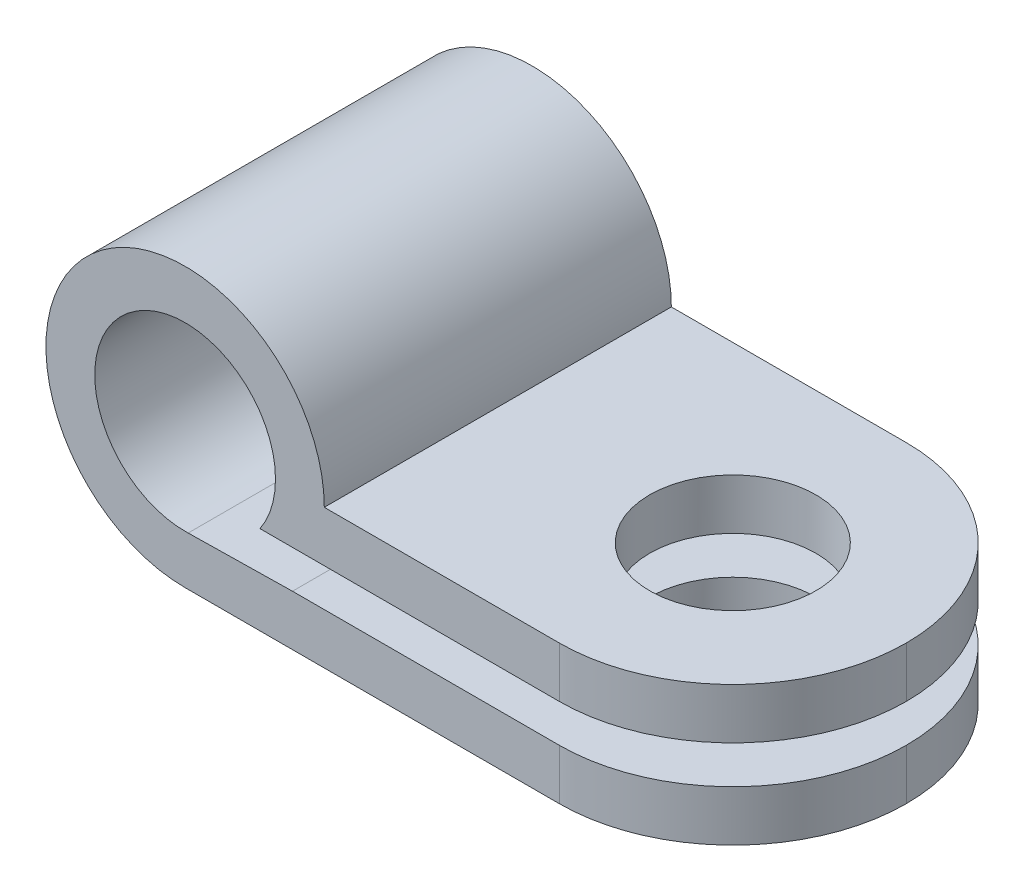
ISO-10303-21;
HEADER;
FILE_DESCRIPTION(('STEP AP214'),'2;1');
FILE_NAME('part.step','',(''),(''),'','','');
FILE_SCHEMA(('AUTOMOTIVE_DESIGN { 1 0 10303 214 1 1 1 1 }'));
ENDSEC;
DATA;
#1=APPLICATION_CONTEXT('core data for automotive mechanical design processes');
#2=APPLICATION_PROTOCOL_DEFINITION('international standard','automotive_design',2000,#1);
#3=PRODUCT_CONTEXT('',#1,'mechanical');
#4=PRODUCT('Part','Part','',(#3));
#5=PRODUCT_RELATED_PRODUCT_CATEGORY('part','',(#4));
#6=PRODUCT_DEFINITION_FORMATION('','',#4);
#7=PRODUCT_DEFINITION_CONTEXT('part definition',#1,'design');
#8=PRODUCT_DEFINITION('design','',#6,#7);
#9=PRODUCT_DEFINITION_SHAPE('','',#8);
#10=(LENGTH_UNIT() NAMED_UNIT(*) SI_UNIT(.MILLI.,.METRE.));
#11=(NAMED_UNIT(*) PLANE_ANGLE_UNIT() SI_UNIT($,.RADIAN.));
#12=(NAMED_UNIT(*) SI_UNIT($,.STERADIAN.) SOLID_ANGLE_UNIT());
#13=UNCERTAINTY_MEASURE_WITH_UNIT(LENGTH_MEASURE(1.E-05),#10,'distance_accuracy_value','');
#14=(GEOMETRIC_REPRESENTATION_CONTEXT(3) GLOBAL_UNCERTAINTY_ASSIGNED_CONTEXT((#13)) GLOBAL_UNIT_ASSIGNED_CONTEXT((#10,
#11,#12)) REPRESENTATION_CONTEXT('',''));
#15=CARTESIAN_POINT('',(0.,0.,0.));
#16=DIRECTION('',(0.,0.,1.));
#17=DIRECTION('',(1.,0.,0.));
#18=AXIS2_PLACEMENT_3D('',#15,#16,#17);
#19=CARTESIAN_POINT('',(0.,0.,9.6));
#20=DIRECTION('',(0.,-1.,0.));
#21=DIRECTION('',(1.,0.,0.));
#22=AXIS2_PLACEMENT_3D('',#19,#20,#21);
#23=PLANE('',#22);
#24=CARTESIAN_POINT('',(10.35,0.,4.8));
#25=DIRECTION('',(0.,1.,0.));
#26=DIRECTION('',(-1.,0.,0.));
#27=AXIS2_PLACEMENT_3D('',#24,#25,#26);
#28=CIRCLE('',#27,2.3);
#29=CARTESIAN_POINT('',(8.05,0.,4.8));
#30=VERTEX_POINT('',#29);
#31=EDGE_CURVE('E378',#30,#30,#28,.T.);
#32=ORIENTED_EDGE('',*,*,#31,.F.);
#33=EDGE_LOOP('',(#32));
#34=FACE_BOUND('',#33,.T.);
#35=CARTESIAN_POINT('',(10.35,0.,4.8));
#36=DIRECTION('',(0.,-1.,0.));
#37=DIRECTION('',(1.,0.,0.));
#38=AXIS2_PLACEMENT_3D('',#35,#36,#37);
#39=CIRCLE('',#38,4.8);
#40=CARTESIAN_POINT('',(10.35,0.,9.6));
#41=VERTEX_POINT('',#40);
#42=CARTESIAN_POINT('',(15.15,0.,4.8));
#43=VERTEX_POINT('',#42);
#44=EDGE_CURVE('E158',#41,#43,#39,.F.);
#45=ORIENTED_EDGE('',*,*,#44,.T.);
#46=CARTESIAN_POINT('',(10.35,0.,4.8));
#47=DIRECTION('',(0.,-1.,0.));
#48=DIRECTION('',(1.,0.,0.));
#49=AXIS2_PLACEMENT_3D('',#46,#47,#48);
#50=CIRCLE('',#49,4.8);
#51=CARTESIAN_POINT('',(10.35,0.,0.));
#52=VERTEX_POINT('',#51);
#53=EDGE_CURVE('E160',#43,#52,#50,.F.);
#54=ORIENTED_EDGE('',*,*,#53,.T.);
#55=DIRECTION('',(-1.,0.,0.));
#56=VECTOR('',#55,1.);
#57=CARTESIAN_POINT('',(0.,0.,0.));
#58=LINE('',#57,#56);
#59=CARTESIAN_POINT('',(3.85000000000002,0.,0.));
#60=VERTEX_POINT('',#59);
#61=EDGE_CURVE('E141',#52,#60,#58,.T.);
#62=ORIENTED_EDGE('',*,*,#61,.T.);
#63=DIRECTION('',(0.,0.,-1.));
#64=VECTOR('',#63,1.);
#65=CARTESIAN_POINT('',(3.85000000000002,0.,9.6));
#66=LINE('',#65,#64);
#67=CARTESIAN_POINT('',(3.85000000000002,0.,9.6));
#68=VERTEX_POINT('',#67);
#69=EDGE_CURVE('E134',#68,#60,#66,.T.);
#70=ORIENTED_EDGE('',*,*,#69,.F.);
#71=DIRECTION('',(-1.,0.,0.));
#72=VECTOR('',#71,1.);
#73=CARTESIAN_POINT('',(0.,0.,9.6));
#74=LINE('',#73,#72);
#75=EDGE_CURVE('E117',#41,#68,#74,.T.);
#76=ORIENTED_EDGE('',*,*,#75,.F.);
#77=EDGE_LOOP('',(#45,#54,#62,#70,#76));
#78=FACE_BOUND('',#77,.T.);
#79=ADVANCED_FACE('F34',(#34,#78),#23,.F.);
#80=CARTESIAN_POINT('',(0.,0.,9.6));
#81=DIRECTION('',(0.,0.,-1.));
#82=DIRECTION('',(-1.,0.,0.));
#83=AXIS2_PLACEMENT_3D('',#80,#81,#82);
#84=CYLINDRICAL_SURFACE('',#83,3.85000000000001);
#85=CARTESIAN_POINT('',(0.,0.,0.));
#86=DIRECTION('',(0.,0.,1.));
#87=DIRECTION('',(1.,0.,0.));
#88=AXIS2_PLACEMENT_3D('',#85,#86,#87);
#89=CIRCLE('',#88,3.85000000000001);
#90=CARTESIAN_POINT('',(0.,-3.85,0.));
#91=VERTEX_POINT('',#90);
#92=EDGE_CURVE('E197',#60,#91,#89,.T.);
#93=ORIENTED_EDGE('',*,*,#92,.T.);
#94=DIRECTION('',(0.,0.,-1.));
#95=VECTOR('',#94,1.);
#96=CARTESIAN_POINT('',(0.,-3.85,9.6));
#97=LINE('',#96,#95);
#98=CARTESIAN_POINT('',(0.,-3.85,9.6));
#99=VERTEX_POINT('',#98);
#100=EDGE_CURVE('E136',#99,#91,#97,.T.);
#101=ORIENTED_EDGE('',*,*,#100,.F.);
#102=CARTESIAN_POINT('',(0.,0.,9.6));
#103=DIRECTION('',(0.,0.,1.));
#104=DIRECTION('',(1.,0.,0.));
#105=AXIS2_PLACEMENT_3D('',#102,#103,#104);
#106=CIRCLE('',#105,3.85000000000001);
#107=EDGE_CURVE('E122',#68,#99,#106,.T.);
#108=ORIENTED_EDGE('',*,*,#107,.F.);
#109=ORIENTED_EDGE('',*,*,#69,.T.);
#110=EDGE_LOOP('',(#93,#101,#108,#109));
#111=FACE_BOUND('',#110,.T.);
#112=ADVANCED_FACE('F133',(#111),#84,.T.);
#113=CARTESIAN_POINT('',(0.,-3.85,9.6));
#114=DIRECTION('',(0.,1.,0.));
#115=DIRECTION('',(0.,0.,1.));
#116=AXIS2_PLACEMENT_3D('',#113,#114,#115);
#117=PLANE('',#116);
#118=CARTESIAN_POINT('',(10.35,-3.85,4.8));
#119=DIRECTION('',(0.,1.,0.));
#120=DIRECTION('',(0.,0.,1.));
#121=AXIS2_PLACEMENT_3D('',#118,#119,#120);
#122=CIRCLE('',#121,2.3);
#123=CARTESIAN_POINT('',(10.35,-3.85,7.1));
#124=VERTEX_POINT('',#123);
#125=EDGE_CURVE('E173',#124,#124,#122,.T.);
#126=ORIENTED_EDGE('',*,*,#125,.T.);
#127=EDGE_LOOP('',(#126));
#128=FACE_BOUND('',#127,.T.);
#129=DIRECTION('',(1.,0.,0.));
#130=VECTOR('',#129,1.);
#131=CARTESIAN_POINT('',(0.,-3.85,0.));
#132=LINE('',#131,#130);
#133=CARTESIAN_POINT('',(10.35,-3.85,0.));
#134=VERTEX_POINT('',#133);
#135=EDGE_CURVE('E199',#91,#134,#132,.T.);
#136=ORIENTED_EDGE('',*,*,#135,.T.);
#137=CARTESIAN_POINT('',(10.35,-3.85,4.8));
#138=DIRECTION('',(0.,1.,0.));
#139=DIRECTION('',(0.,0.,1.));
#140=AXIS2_PLACEMENT_3D('',#137,#138,#139);
#141=CIRCLE('',#140,4.8);
#142=CARTESIAN_POINT('',(15.15,-3.85,4.8));
#143=VERTEX_POINT('',#142);
#144=EDGE_CURVE('E11',#134,#143,#141,.F.);
#145=ORIENTED_EDGE('',*,*,#144,.T.);
#146=CARTESIAN_POINT('',(10.35,-3.85,4.8));
#147=DIRECTION('',(0.,1.,0.));
#148=DIRECTION('',(0.,0.,1.));
#149=AXIS2_PLACEMENT_3D('',#146,#147,#148);
#150=CIRCLE('',#149,4.8);
#151=CARTESIAN_POINT('',(10.35,-3.85,9.6));
#152=VERTEX_POINT('',#151);
#153=EDGE_CURVE('E43',#143,#152,#150,.F.);
#154=ORIENTED_EDGE('',*,*,#153,.T.);
#155=DIRECTION('',(1.,0.,0.));
#156=VECTOR('',#155,1.);
#157=CARTESIAN_POINT('',(0.,-3.85,9.6));
#158=LINE('',#157,#156);
#159=EDGE_CURVE('E138',#99,#152,#158,.T.);
#160=ORIENTED_EDGE('',*,*,#159,.F.);
#161=ORIENTED_EDGE('',*,*,#100,.T.);
#162=EDGE_LOOP('',(#136,#145,#154,#160,#161));
#163=FACE_BOUND('',#162,.T.);
#164=ADVANCED_FACE('F235',(#128,#163),#117,.F.);
#165=CARTESIAN_POINT('',(0.,-2.45000000000001,9.6));
#166=DIRECTION('',(0.,-1.,0.));
#167=DIRECTION('',(1.,0.,0.));
#168=AXIS2_PLACEMENT_3D('',#165,#166,#167);
#169=PLANE('',#168);
#170=CARTESIAN_POINT('',(10.35,-2.45,4.8));
#171=DIRECTION('',(0.,-1.,0.));
#172=DIRECTION('',(1.,0.,0.));
#173=AXIS2_PLACEMENT_3D('',#170,#171,#172);
#174=CIRCLE('',#173,2.3);
#175=CARTESIAN_POINT('',(12.65,-2.45,4.8));
#176=VERTEX_POINT('',#175);
#177=EDGE_CURVE('E177',#176,#176,#174,.T.);
#178=ORIENTED_EDGE('',*,*,#177,.T.);
#179=EDGE_LOOP('',(#178));
#180=FACE_BOUND('',#179,.T.);
#181=CARTESIAN_POINT('',(10.35,-2.45,4.8));
#182=DIRECTION('',(0.,-1.,0.));
#183=DIRECTION('',(1.,0.,0.));
#184=AXIS2_PLACEMENT_3D('',#181,#182,#183);
#185=CIRCLE('',#184,4.8);
#186=CARTESIAN_POINT('',(10.35,-2.45,9.6));
#187=VERTEX_POINT('',#186);
#188=CARTESIAN_POINT('',(15.15,-2.45,4.8));
#189=VERTEX_POINT('',#188);
#190=EDGE_CURVE('E57',#187,#189,#185,.F.);
#191=ORIENTED_EDGE('',*,*,#190,.T.);
#192=CARTESIAN_POINT('',(10.35,-2.45,4.8));
#193=DIRECTION('',(0.,-1.,0.));
#194=DIRECTION('',(1.,0.,0.));
#195=AXIS2_PLACEMENT_3D('',#192,#193,#194);
#196=CIRCLE('',#195,4.8);
#197=CARTESIAN_POINT('',(10.35,-2.45,0.));
#198=VERTEX_POINT('',#197);
#199=EDGE_CURVE('E166',#189,#198,#196,.F.);
#200=ORIENTED_EDGE('',*,*,#199,.T.);
#201=DIRECTION('',(-1.,0.,0.));
#202=VECTOR('',#201,1.);
#203=CARTESIAN_POINT('',(0.,-2.45000000000001,0.));
#204=LINE('',#203,#202);
#205=CARTESIAN_POINT('',(2.96984848098402,-2.45000000000001,0.));
#206=VERTEX_POINT('',#205);
#207=EDGE_CURVE('E201',#198,#206,#204,.T.);
#208=ORIENTED_EDGE('',*,*,#207,.T.);
#209=DIRECTION('',(0.,0.,-1.));
#210=VECTOR('',#209,1.);
#211=CARTESIAN_POINT('',(2.96984848098402,-2.45000000000001,9.6));
#212=LINE('',#211,#210);
#213=CARTESIAN_POINT('',(2.96984848098402,-2.45000000000001,9.6));
#214=VERTEX_POINT('',#213);
#215=EDGE_CURVE('E148',#214,#206,#212,.T.);
#216=ORIENTED_EDGE('',*,*,#215,.F.);
#217=DIRECTION('',(-1.,0.,0.));
#218=VECTOR('',#217,1.);
#219=CARTESIAN_POINT('',(0.,-2.45000000000001,9.6));
#220=LINE('',#219,#218);
#221=EDGE_CURVE('E186',#187,#214,#220,.T.);
#222=ORIENTED_EDGE('',*,*,#221,.F.);
#223=EDGE_LOOP('',(#191,#200,#208,#216,#222));
#224=FACE_BOUND('',#223,.T.);
#225=ADVANCED_FACE('F231',(#180,#224),#169,.F.);
#226=CARTESIAN_POINT('',(0.0420777625528821,-2.49929158401814,9.6));
#227=DIRECTION('',(0.0168334902128351,-0.999858306765141,0.));
#228=DIRECTION('',(0.999858306765141,0.0168334902128351,0.));
#229=AXIS2_PLACEMENT_3D('',#226,#227,#228);
#230=PLANE('',#229);
#231=DIRECTION('',(-0.999858306765141,-0.0168334902128351,0.));
#232=VECTOR('',#231,1.);
#233=CARTESIAN_POINT('',(0.0420777625528821,-2.49929158401814,0.));
#234=LINE('',#233,#232);
#235=CARTESIAN_POINT('',(0.0841555251056994,-2.49858316803627,0.));
#236=VERTEX_POINT('',#235);
#237=EDGE_CURVE('E203',#206,#236,#234,.T.);
#238=ORIENTED_EDGE('',*,*,#237,.T.);
#239=DIRECTION('',(0.,0.,-1.));
#240=VECTOR('',#239,1.);
#241=CARTESIAN_POINT('',(0.0841555251056994,-2.49858316803627,9.6));
#242=LINE('',#241,#240);
#243=CARTESIAN_POINT('',(0.0841555251056994,-2.49858316803627,9.6));
#244=VERTEX_POINT('',#243);
#245=EDGE_CURVE('E212',#244,#236,#242,.T.);
#246=ORIENTED_EDGE('',*,*,#245,.F.);
#247=DIRECTION('',(-0.999858306765141,-0.0168334902128351,0.));
#248=VECTOR('',#247,1.);
#249=CARTESIAN_POINT('',(0.0420777625528821,-2.49929158401814,9.6));
#250=LINE('',#249,#248);
#251=EDGE_CURVE('E188',#214,#244,#250,.T.);
#252=ORIENTED_EDGE('',*,*,#251,.F.);
#253=ORIENTED_EDGE('',*,*,#215,.T.);
#254=EDGE_LOOP('',(#238,#246,#252,#253));
#255=FACE_BOUND('',#254,.T.);
#256=ADVANCED_FACE('F218',(#255),#230,.F.);
#257=CARTESIAN_POINT('',(0.,0.,9.6));
#258=DIRECTION('',(0.,0.,-1.));
#259=DIRECTION('',(-1.,0.,0.));
#260=AXIS2_PLACEMENT_3D('',#257,#258,#259);
#261=CYLINDRICAL_SURFACE('',#260,2.5);
#262=CARTESIAN_POINT('',(0.,0.,0.));
#263=DIRECTION('',(0.,0.,1.));
#264=DIRECTION('',(1.,0.,0.));
#265=AXIS2_PLACEMENT_3D('',#262,#263,#264);
#266=CIRCLE('',#265,2.5);
#267=CARTESIAN_POINT('',(2.0712315177208,-1.4,0.));
#268=VERTEX_POINT('',#267);
#269=EDGE_CURVE('E206',#268,#236,#266,.T.);
#270=ORIENTED_EDGE('',*,*,#269,.F.);
#271=DIRECTION('',(0.,0.,-1.));
#272=VECTOR('',#271,1.);
#273=CARTESIAN_POINT('',(2.0712315177208,-1.4,9.6));
#274=LINE('',#273,#272);
#275=CARTESIAN_POINT('',(2.0712315177208,-1.4,9.6));
#276=VERTEX_POINT('',#275);
#277=EDGE_CURVE('E195',#276,#268,#274,.T.);
#278=ORIENTED_EDGE('',*,*,#277,.F.);
#279=CARTESIAN_POINT('',(0.,0.,9.6));
#280=DIRECTION('',(0.,0.,1.));
#281=DIRECTION('',(1.,0.,0.));
#282=AXIS2_PLACEMENT_3D('',#279,#280,#281);
#283=CIRCLE('',#282,2.5);
#284=EDGE_CURVE('E190',#276,#244,#283,.T.);
#285=ORIENTED_EDGE('',*,*,#284,.T.);
#286=ORIENTED_EDGE('',*,*,#245,.T.);
#287=EDGE_LOOP('',(#270,#278,#285,#286));
#288=FACE_BOUND('',#287,.T.);
#289=ADVANCED_FACE('F228',(#288),#261,.F.);
#290=CARTESIAN_POINT('',(0.,-1.4,9.6));
#291=DIRECTION('',(0.,-1.,0.));
#292=DIRECTION('',(1.,0.,0.));
#293=AXIS2_PLACEMENT_3D('',#290,#291,#292);
#294=PLANE('',#293);
#295=CARTESIAN_POINT('',(10.35,-1.4,4.8));
#296=DIRECTION('',(0.,-1.,0.));
#297=DIRECTION('',(1.,0.,0.));
#298=AXIS2_PLACEMENT_3D('',#295,#296,#297);
#299=CIRCLE('',#298,2.3);
#300=CARTESIAN_POINT('',(12.65,-1.4,4.8));
#301=VERTEX_POINT('',#300);
#302=EDGE_CURVE('E38',#301,#301,#299,.T.);
#303=ORIENTED_EDGE('',*,*,#302,.F.);
#304=EDGE_LOOP('',(#303));
#305=FACE_BOUND('',#304,.T.);
#306=DIRECTION('',(-1.,0.,0.));
#307=VECTOR('',#306,1.);
#308=CARTESIAN_POINT('',(0.,-1.4,0.));
#309=LINE('',#308,#307);
#310=CARTESIAN_POINT('',(10.35,-1.4,0.));
#311=VERTEX_POINT('',#310);
#312=EDGE_CURVE('E129',#311,#268,#309,.T.);
#313=ORIENTED_EDGE('',*,*,#312,.F.);
#314=CARTESIAN_POINT('',(10.35,-1.4,4.8));
#315=DIRECTION('',(0.,-1.,0.));
#316=DIRECTION('',(1.,0.,0.));
#317=AXIS2_PLACEMENT_3D('',#314,#315,#316);
#318=CIRCLE('',#317,4.8);
#319=CARTESIAN_POINT('',(15.15,-1.4,4.8));
#320=VERTEX_POINT('',#319);
#321=EDGE_CURVE('E156',#311,#320,#318,.T.);
#322=ORIENTED_EDGE('',*,*,#321,.T.);
#323=CARTESIAN_POINT('',(10.35,-1.4,4.8));
#324=DIRECTION('',(0.,-1.,0.));
#325=DIRECTION('',(1.,0.,0.));
#326=AXIS2_PLACEMENT_3D('',#323,#324,#325);
#327=CIRCLE('',#326,4.8);
#328=CARTESIAN_POINT('',(10.35,-1.4,9.6));
#329=VERTEX_POINT('',#328);
#330=EDGE_CURVE('E154',#320,#329,#327,.T.);
#331=ORIENTED_EDGE('',*,*,#330,.T.);
#332=DIRECTION('',(-1.,0.,0.));
#333=VECTOR('',#332,1.);
#334=CARTESIAN_POINT('',(0.,-1.4,9.6));
#335=LINE('',#334,#333);
#336=EDGE_CURVE('E193',#329,#276,#335,.T.);
#337=ORIENTED_EDGE('',*,*,#336,.T.);
#338=ORIENTED_EDGE('',*,*,#277,.T.);
#339=EDGE_LOOP('',(#313,#322,#331,#337,#338));
#340=FACE_BOUND('',#339,.T.);
#341=ADVANCED_FACE('F290',(#305,#340),#294,.T.);
#342=CARTESIAN_POINT('',(0.,0.,9.6));
#343=DIRECTION('',(0.,0.,1.));
#344=DIRECTION('',(1.,0.,0.));
#345=AXIS2_PLACEMENT_3D('',#342,#343,#344);
#346=PLANE('',#345);
#347=ORIENTED_EDGE('',*,*,#336,.F.);
#348=DIRECTION('',(0.,-1.,0.));
#349=VECTOR('',#348,1.);
#350=CARTESIAN_POINT('',(10.35,0.,9.6));
#351=LINE('',#350,#349);
#352=EDGE_CURVE('E125',#329,#41,#351,.F.);
#353=ORIENTED_EDGE('',*,*,#352,.T.);
#354=ORIENTED_EDGE('',*,*,#75,.T.);
#355=ORIENTED_EDGE('',*,*,#107,.T.);
#356=ORIENTED_EDGE('',*,*,#159,.T.);
#357=DIRECTION('',(0.,1.,0.));
#358=VECTOR('',#357,1.);
#359=CARTESIAN_POINT('',(10.35,-2.45,9.6));
#360=LINE('',#359,#358);
#361=EDGE_CURVE('E162',#152,#187,#360,.T.);
#362=ORIENTED_EDGE('',*,*,#361,.T.);
#363=ORIENTED_EDGE('',*,*,#221,.T.);
#364=ORIENTED_EDGE('',*,*,#251,.T.);
#365=ORIENTED_EDGE('',*,*,#284,.F.);
#366=EDGE_LOOP('',(#347,#353,#354,#355,#356,#362,#363,#364,#365));
#367=FACE_BOUND('',#366,.T.);
#368=ADVANCED_FACE('F120',(#367),#346,.T.);
#369=CARTESIAN_POINT('',(0.,0.,0.));
#370=DIRECTION('',(0.,0.,1.));
#371=DIRECTION('',(1.,0.,0.));
#372=AXIS2_PLACEMENT_3D('',#369,#370,#371);
#373=PLANE('',#372);
#374=ORIENTED_EDGE('',*,*,#61,.F.);
#375=DIRECTION('',(0.,-1.,0.));
#376=VECTOR('',#375,1.);
#377=CARTESIAN_POINT('',(10.35,-1.4,0.));
#378=LINE('',#377,#376);
#379=EDGE_CURVE('E146',#52,#311,#378,.T.);
#380=ORIENTED_EDGE('',*,*,#379,.T.);
#381=ORIENTED_EDGE('',*,*,#312,.T.);
#382=ORIENTED_EDGE('',*,*,#269,.T.);
#383=ORIENTED_EDGE('',*,*,#237,.F.);
#384=ORIENTED_EDGE('',*,*,#207,.F.);
#385=DIRECTION('',(0.,1.,0.));
#386=VECTOR('',#385,1.);
#387=CARTESIAN_POINT('',(10.35,0.,0.));
#388=LINE('',#387,#386);
#389=EDGE_CURVE('E143',#198,#134,#388,.F.);
#390=ORIENTED_EDGE('',*,*,#389,.T.);
#391=ORIENTED_EDGE('',*,*,#135,.F.);
#392=ORIENTED_EDGE('',*,*,#92,.F.);
#393=EDGE_LOOP('',(#374,#380,#381,#382,#383,#384,#390,#391,#392));
#394=FACE_BOUND('',#393,.T.);
#395=ADVANCED_FACE('F222',(#394),#373,.F.);
#396=CARTESIAN_POINT('',(10.35,0.,4.8));
#397=DIRECTION('',(0.,-1.,0.));
#398=DIRECTION('',(0.,0.,-1.));
#399=AXIS2_PLACEMENT_3D('',#396,#397,#398);
#400=CYLINDRICAL_SURFACE('',#399,4.8);
#401=DIRECTION('',(0.,-1.,0.));
#402=VECTOR('',#401,1.);
#403=CARTESIAN_POINT('',(15.15,0.,4.8));
#404=LINE('',#403,#402);
#405=EDGE_CURVE('E169',#43,#320,#404,.T.);
#406=ORIENTED_EDGE('',*,*,#405,.F.);
#407=ORIENTED_EDGE('',*,*,#44,.F.);
#408=ORIENTED_EDGE('',*,*,#352,.F.);
#409=ORIENTED_EDGE('',*,*,#330,.F.);
#410=EDGE_LOOP('',(#406,#407,#408,#409));
#411=FACE_BOUND('',#410,.T.);
#412=ADVANCED_FACE('F255',(#411),#400,.T.);
#413=CARTESIAN_POINT('',(10.35,0.,4.8));
#414=DIRECTION('',(0.,1.,0.));
#415=DIRECTION('',(0.,0.,1.));
#416=AXIS2_PLACEMENT_3D('',#413,#414,#415);
#417=CYLINDRICAL_SURFACE('',#416,4.8);
#418=ORIENTED_EDGE('',*,*,#53,.F.);
#419=ORIENTED_EDGE('',*,*,#405,.T.);
#420=ORIENTED_EDGE('',*,*,#321,.F.);
#421=ORIENTED_EDGE('',*,*,#379,.F.);
#422=EDGE_LOOP('',(#418,#419,#420,#421));
#423=FACE_BOUND('',#422,.T.);
#424=ADVANCED_FACE('F252',(#423),#417,.T.);
#425=CARTESIAN_POINT('',(10.35,0.,4.8));
#426=DIRECTION('',(0.,-1.,0.));
#427=DIRECTION('',(0.,0.,-1.));
#428=AXIS2_PLACEMENT_3D('',#425,#426,#427);
#429=CYLINDRICAL_SURFACE('',#428,4.8);
#430=ORIENTED_EDGE('',*,*,#361,.F.);
#431=ORIENTED_EDGE('',*,*,#153,.F.);
#432=DIRECTION('',(0.,1.,0.));
#433=VECTOR('',#432,1.);
#434=CARTESIAN_POINT('',(15.15,-3.85,4.8));
#435=LINE('',#434,#433);
#436=EDGE_CURVE('E171',#189,#143,#435,.F.);
#437=ORIENTED_EDGE('',*,*,#436,.F.);
#438=ORIENTED_EDGE('',*,*,#190,.F.);
#439=EDGE_LOOP('',(#430,#431,#437,#438));
#440=FACE_BOUND('',#439,.T.);
#441=ADVANCED_FACE('F36',(#440),#429,.T.);
#442=CARTESIAN_POINT('',(10.35,0.,4.8));
#443=DIRECTION('',(0.,1.,0.));
#444=DIRECTION('',(0.,0.,1.));
#445=AXIS2_PLACEMENT_3D('',#442,#443,#444);
#446=CYLINDRICAL_SURFACE('',#445,4.8);
#447=ORIENTED_EDGE('',*,*,#144,.F.);
#448=ORIENTED_EDGE('',*,*,#389,.F.);
#449=ORIENTED_EDGE('',*,*,#199,.F.);
#450=ORIENTED_EDGE('',*,*,#436,.T.);
#451=EDGE_LOOP('',(#447,#448,#449,#450));
#452=FACE_BOUND('',#451,.T.);
#453=ADVANCED_FACE('F233',(#452),#446,.T.);
#454=CARTESIAN_POINT('',(10.35,-10.,4.8));
#455=DIRECTION('',(0.,1.,0.));
#456=DIRECTION('',(-1.,0.,0.));
#457=AXIS2_PLACEMENT_3D('',#454,#455,#456);
#458=CYLINDRICAL_SURFACE('',#457,2.3);
#459=ORIENTED_EDGE('',*,*,#302,.T.);
#460=EDGE_LOOP('',(#459));
#461=FACE_BOUND('',#460,.T.);
#462=ORIENTED_EDGE('',*,*,#31,.T.);
#463=EDGE_LOOP('',(#462));
#464=FACE_BOUND('',#463,.T.);
#465=ADVANCED_FACE('F260',(#461,#464),#458,.F.);
#466=ORIENTED_EDGE('',*,*,#177,.F.);
#467=EDGE_LOOP('',(#466));
#468=FACE_BOUND('',#467,.T.);
#469=ORIENTED_EDGE('',*,*,#125,.F.);
#470=EDGE_LOOP('',(#469));
#471=FACE_BOUND('',#470,.T.);
#472=ADVANCED_FACE('F265',(#468,#471),#458,.F.);
#473=CLOSED_SHELL('',(#79,#112,#164,#225,#256,#289,#341,#368,#395,#412,#424,#441,#453,#465,#472));
#474=MANIFOLD_SOLID_BREP('B2',#473);
#475=ADVANCED_BREP_SHAPE_REPRESENTATION('',(#18,#474),#14);
#476=SHAPE_DEFINITION_REPRESENTATION(#9,#475);
ENDSEC;
END-ISO-10303-21;
